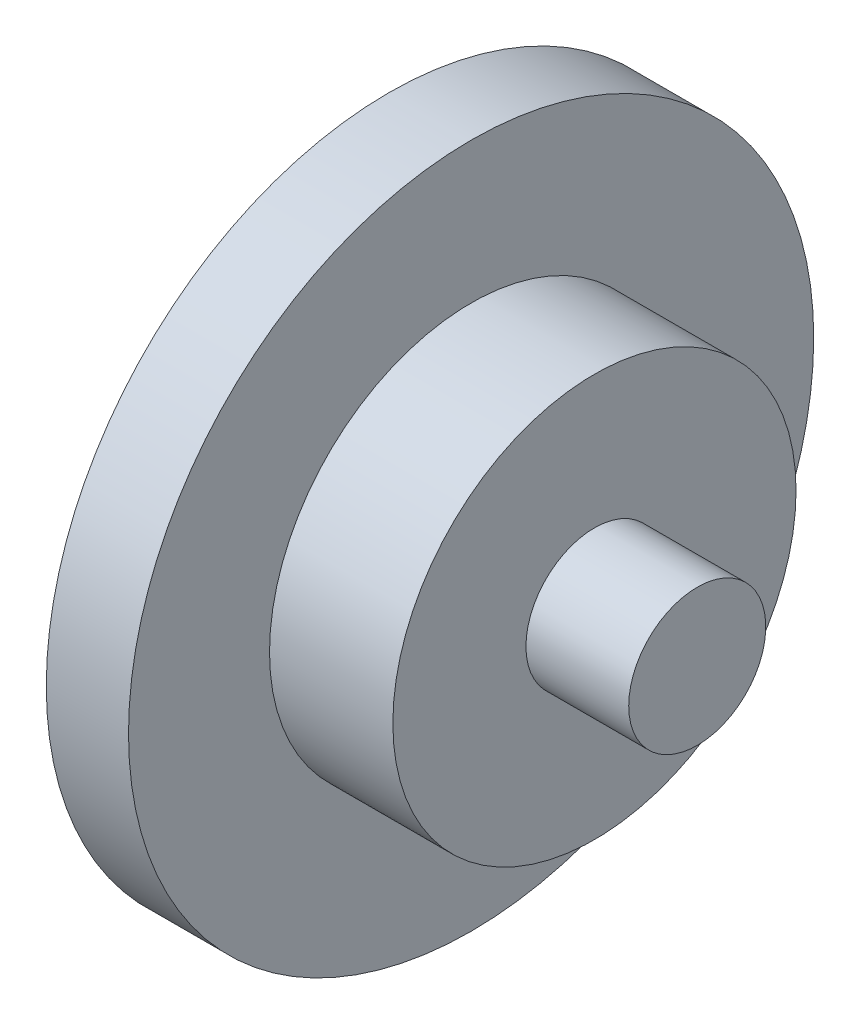
ISO-10303-21;
HEADER;
FILE_DESCRIPTION(('STEP AP214'),'2;1');
FILE_NAME('part.step','',(''),(''),'','','');
FILE_SCHEMA(('AUTOMOTIVE_DESIGN { 1 0 10303 214 1 1 1 1 }'));
ENDSEC;
DATA;
#1=APPLICATION_CONTEXT('core data for automotive mechanical design processes');
#2=APPLICATION_PROTOCOL_DEFINITION('international standard','automotive_design',2000,#1);
#3=PRODUCT_CONTEXT('',#1,'mechanical');
#4=PRODUCT('Part','Part','',(#3));
#5=PRODUCT_RELATED_PRODUCT_CATEGORY('part','',(#4));
#6=PRODUCT_DEFINITION_FORMATION('','',#4);
#7=PRODUCT_DEFINITION_CONTEXT('part definition',#1,'design');
#8=PRODUCT_DEFINITION('design','',#6,#7);
#9=PRODUCT_DEFINITION_SHAPE('','',#8);
#10=(LENGTH_UNIT() NAMED_UNIT(*) SI_UNIT(.MILLI.,.METRE.));
#11=(NAMED_UNIT(*) PLANE_ANGLE_UNIT() SI_UNIT($,.RADIAN.));
#12=(NAMED_UNIT(*) SI_UNIT($,.STERADIAN.) SOLID_ANGLE_UNIT());
#13=UNCERTAINTY_MEASURE_WITH_UNIT(LENGTH_MEASURE(1.E-05),#10,'distance_accuracy_value','');
#14=(GEOMETRIC_REPRESENTATION_CONTEXT(3) GLOBAL_UNCERTAINTY_ASSIGNED_CONTEXT((#13)) GLOBAL_UNIT_ASSIGNED_CONTEXT((#10,
#11,#12)) REPRESENTATION_CONTEXT('',''));
#15=CARTESIAN_POINT('',(0.,0.,0.));
#16=DIRECTION('',(0.,0.,1.));
#17=DIRECTION('',(1.,0.,0.));
#18=AXIS2_PLACEMENT_3D('',#15,#16,#17);
#19=CARTESIAN_POINT('',(0.,0.,0.));
#20=DIRECTION('',(-1.,0.,0.));
#21=DIRECTION('',(0.,0.,1.));
#22=AXIS2_PLACEMENT_3D('',#19,#20,#21);
#23=PLANE('',#22);
#24=CARTESIAN_POINT('',(0.,0.,0.));
#25=DIRECTION('',(-1.,0.,0.));
#26=DIRECTION('',(0.,0.,1.));
#27=AXIS2_PLACEMENT_3D('',#24,#25,#26);
#28=CIRCLE('',#27,10.);
#29=CARTESIAN_POINT('',(0.,0.,10.));
#30=VERTEX_POINT('',#29);
#31=EDGE_CURVE('E10',#30,#30,#28,.T.);
#32=ORIENTED_EDGE('',*,*,#31,.F.);
#33=EDGE_LOOP('',(#32));
#34=FACE_BOUND('',#33,.T.);
#35=ADVANCED_FACE('F31',(#34),#23,.F.);
#36=CARTESIAN_POINT('',(-45.,0.,0.));
#37=DIRECTION('',(-1.,0.,0.));
#38=DIRECTION('',(0.,0.,1.));
#39=AXIS2_PLACEMENT_3D('',#36,#37,#38);
#40=CYLINDRICAL_SURFACE('',#39,10.);
#41=CARTESIAN_POINT('',(-15.,0.,0.));
#42=DIRECTION('',(-1.,0.,0.));
#43=DIRECTION('',(0.,0.,1.));
#44=AXIS2_PLACEMENT_3D('',#41,#42,#43);
#45=CIRCLE('',#44,10.);
#46=CARTESIAN_POINT('',(-15.,0.,10.));
#47=VERTEX_POINT('',#46);
#48=EDGE_CURVE('E37',#47,#47,#45,.T.);
#49=ORIENTED_EDGE('',*,*,#48,.F.);
#50=EDGE_LOOP('',(#49));
#51=FACE_BOUND('',#50,.T.);
#52=ORIENTED_EDGE('',*,*,#31,.T.);
#53=EDGE_LOOP('',(#52));
#54=FACE_BOUND('',#53,.T.);
#55=ADVANCED_FACE('F79',(#51,#54),#40,.T.);
#56=CARTESIAN_POINT('',(-15.,10.,0.));
#57=DIRECTION('',(-1.,0.,0.));
#58=DIRECTION('',(0.,0.,1.));
#59=AXIS2_PLACEMENT_3D('',#56,#57,#58);
#60=PLANE('',#59);
#61=CARTESIAN_POINT('',(-15.,0.,0.));
#62=DIRECTION('',(-1.,0.,0.));
#63=DIRECTION('',(0.,0.,1.));
#64=AXIS2_PLACEMENT_3D('',#61,#62,#63);
#65=CIRCLE('',#64,29.4212218649518);
#66=CARTESIAN_POINT('',(-15.,0.,29.4212218649518));
#67=VERTEX_POINT('',#66);
#68=EDGE_CURVE('E41',#67,#67,#65,.T.);
#69=ORIENTED_EDGE('',*,*,#68,.F.);
#70=EDGE_LOOP('',(#69));
#71=FACE_BOUND('',#70,.T.);
#72=ORIENTED_EDGE('',*,*,#48,.T.);
#73=EDGE_LOOP('',(#72));
#74=FACE_BOUND('',#73,.T.);
#75=ADVANCED_FACE('F74',(#71,#74),#60,.F.);
#76=CARTESIAN_POINT('',(-45.,0.,0.));
#77=DIRECTION('',(-1.,0.,0.));
#78=DIRECTION('',(0.,0.,1.));
#79=AXIS2_PLACEMENT_3D('',#76,#77,#78);
#80=CYLINDRICAL_SURFACE('',#79,29.4212218649518);
#81=CARTESIAN_POINT('',(-33.,0.,0.));
#82=DIRECTION('',(-1.,0.,0.));
#83=DIRECTION('',(0.,0.,1.));
#84=AXIS2_PLACEMENT_3D('',#81,#82,#83);
#85=CIRCLE('',#84,29.4212218649518);
#86=CARTESIAN_POINT('',(-33.,0.,29.4212218649518));
#87=VERTEX_POINT('',#86);
#88=EDGE_CURVE('E45',#87,#87,#85,.T.);
#89=ORIENTED_EDGE('',*,*,#88,.F.);
#90=EDGE_LOOP('',(#89));
#91=FACE_BOUND('',#90,.T.);
#92=ORIENTED_EDGE('',*,*,#68,.T.);
#93=EDGE_LOOP('',(#92));
#94=FACE_BOUND('',#93,.T.);
#95=ADVANCED_FACE('F68',(#91,#94),#80,.T.);
#96=CARTESIAN_POINT('',(-33.,29.4212218649518,0.));
#97=DIRECTION('',(-1.,0.,0.));
#98=DIRECTION('',(0.,0.,1.));
#99=AXIS2_PLACEMENT_3D('',#96,#97,#98);
#100=PLANE('',#99);
#101=CARTESIAN_POINT('',(-33.,0.,0.));
#102=DIRECTION('',(-1.,0.,0.));
#103=DIRECTION('',(0.,0.,1.));
#104=AXIS2_PLACEMENT_3D('',#101,#102,#103);
#105=CIRCLE('',#104,50.);
#106=CARTESIAN_POINT('',(-33.,0.,50.));
#107=VERTEX_POINT('',#106);
#108=EDGE_CURVE('E50',#107,#107,#105,.T.);
#109=ORIENTED_EDGE('',*,*,#108,.F.);
#110=EDGE_LOOP('',(#109));
#111=FACE_BOUND('',#110,.T.);
#112=ORIENTED_EDGE('',*,*,#88,.T.);
#113=EDGE_LOOP('',(#112));
#114=FACE_BOUND('',#113,.T.);
#115=ADVANCED_FACE('F62',(#111,#114),#100,.F.);
#116=CARTESIAN_POINT('',(-45.,0.,0.));
#117=DIRECTION('',(-1.,0.,0.));
#118=DIRECTION('',(0.,0.,1.));
#119=AXIS2_PLACEMENT_3D('',#116,#117,#118);
#120=CYLINDRICAL_SURFACE('',#119,50.);
#121=CARTESIAN_POINT('',(-45.,0.,0.));
#122=DIRECTION('',(-1.,0.,0.));
#123=DIRECTION('',(0.,0.,1.));
#124=AXIS2_PLACEMENT_3D('',#121,#122,#123);
#125=CIRCLE('',#124,50.);
#126=CARTESIAN_POINT('',(-45.,0.,50.));
#127=VERTEX_POINT('',#126);
#128=EDGE_CURVE('E53',#127,#127,#125,.T.);
#129=ORIENTED_EDGE('',*,*,#128,.F.);
#130=EDGE_LOOP('',(#129));
#131=FACE_BOUND('',#130,.T.);
#132=ORIENTED_EDGE('',*,*,#108,.T.);
#133=EDGE_LOOP('',(#132));
#134=FACE_BOUND('',#133,.T.);
#135=ADVANCED_FACE('F59',(#131,#134),#120,.T.);
#136=CARTESIAN_POINT('',(-45.,50.,0.));
#137=DIRECTION('',(1.,0.,0.));
#138=DIRECTION('',(0.,0.,-1.));
#139=AXIS2_PLACEMENT_3D('',#136,#137,#138);
#140=PLANE('',#139);
#141=ORIENTED_EDGE('',*,*,#128,.T.);
#142=EDGE_LOOP('',(#141));
#143=FACE_BOUND('',#142,.T.);
#144=ADVANCED_FACE('F57',(#143),#140,.F.);
#145=CLOSED_SHELL('',(#35,#55,#75,#95,#115,#135,#144));
#146=MANIFOLD_SOLID_BREP('B2',#145);
#147=ADVANCED_BREP_SHAPE_REPRESENTATION('',(#18,#146),#14);
#148=SHAPE_DEFINITION_REPRESENTATION(#9,#147);
ENDSEC;
END-ISO-10303-21;
